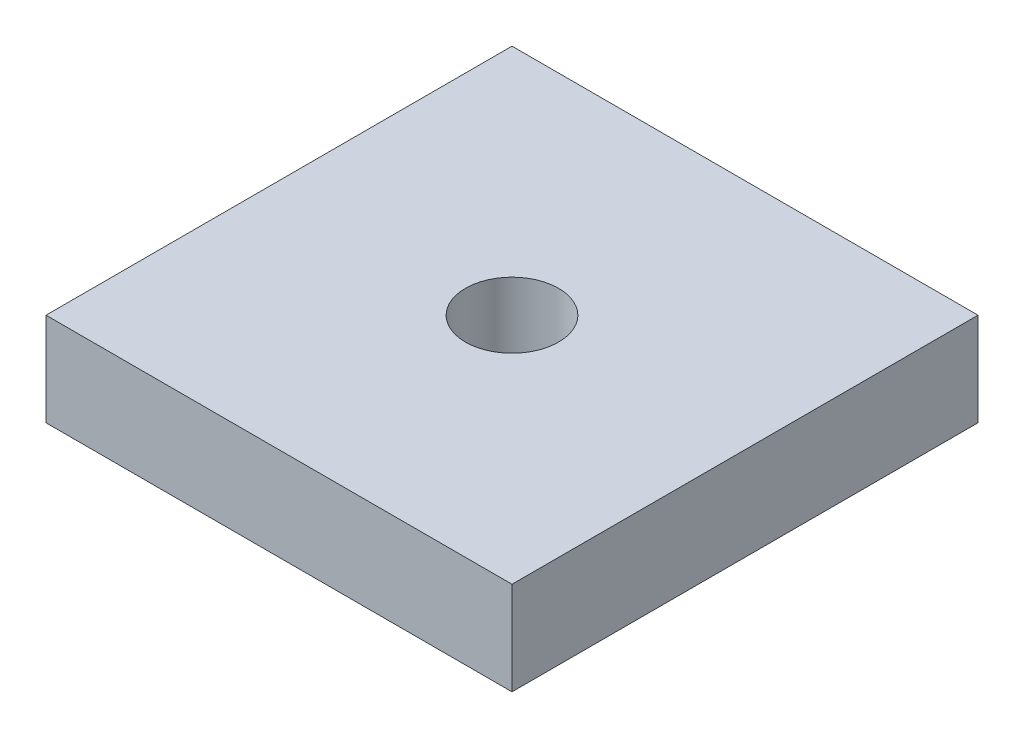
ISO-10303-21;
HEADER;
FILE_DESCRIPTION(('STEP AP214'),'2;1');
FILE_NAME('part.step','',(''),(''),'','','');
FILE_SCHEMA(('AUTOMOTIVE_DESIGN { 1 0 10303 214 1 1 1 1 }'));
ENDSEC;
DATA;
#1=APPLICATION_CONTEXT('core data for automotive mechanical design processes');
#2=APPLICATION_PROTOCOL_DEFINITION('international standard','automotive_design',2000,#1);
#3=PRODUCT_CONTEXT('',#1,'mechanical');
#4=PRODUCT('Part','Part','',(#3));
#5=PRODUCT_RELATED_PRODUCT_CATEGORY('part','',(#4));
#6=PRODUCT_DEFINITION_FORMATION('','',#4);
#7=PRODUCT_DEFINITION_CONTEXT('part definition',#1,'design');
#8=PRODUCT_DEFINITION('design','',#6,#7);
#9=PRODUCT_DEFINITION_SHAPE('','',#8);
#10=(LENGTH_UNIT() NAMED_UNIT(*) SI_UNIT(.MILLI.,.METRE.));
#11=(NAMED_UNIT(*) PLANE_ANGLE_UNIT() SI_UNIT($,.RADIAN.));
#12=(NAMED_UNIT(*) SI_UNIT($,.STERADIAN.) SOLID_ANGLE_UNIT());
#13=UNCERTAINTY_MEASURE_WITH_UNIT(LENGTH_MEASURE(1.E-05),#10,'distance_accuracy_value','');
#14=(GEOMETRIC_REPRESENTATION_CONTEXT(3) GLOBAL_UNCERTAINTY_ASSIGNED_CONTEXT((#13)) GLOBAL_UNIT_ASSIGNED_CONTEXT((#10,
#11,#12)) REPRESENTATION_CONTEXT('',''));
#15=CARTESIAN_POINT('',(0.,0.,0.));
#16=DIRECTION('',(0.,0.,1.));
#17=DIRECTION('',(1.,0.,0.));
#18=AXIS2_PLACEMENT_3D('',#15,#16,#17);
#19=CARTESIAN_POINT('',(-25.,10.,-25.));
#20=DIRECTION('',(1.,0.,0.));
#21=DIRECTION('',(0.,0.,-1.));
#22=AXIS2_PLACEMENT_3D('',#19,#20,#21);
#23=PLANE('',#22);
#24=DIRECTION('',(0.,0.,1.));
#25=VECTOR('',#24,1.);
#26=CARTESIAN_POINT('',(-25.,0.,-25.));
#27=LINE('',#26,#25);
#28=CARTESIAN_POINT('',(-25.,0.,-25.));
#29=VERTEX_POINT('',#28);
#30=CARTESIAN_POINT('',(-25.,0.,25.));
#31=VERTEX_POINT('',#30);
#32=EDGE_CURVE('E98',#29,#31,#27,.T.);
#33=ORIENTED_EDGE('',*,*,#32,.T.);
#34=DIRECTION('',(0.,-1.,0.));
#35=VECTOR('',#34,1.);
#36=CARTESIAN_POINT('',(-25.,10.,25.));
#37=LINE('',#36,#35);
#38=CARTESIAN_POINT('',(-25.,10.,25.));
#39=VERTEX_POINT('',#38);
#40=EDGE_CURVE('E11',#39,#31,#37,.T.);
#41=ORIENTED_EDGE('',*,*,#40,.F.);
#42=DIRECTION('',(0.,0.,1.));
#43=VECTOR('',#42,1.);
#44=CARTESIAN_POINT('',(-25.,10.,-25.));
#45=LINE('',#44,#43);
#46=CARTESIAN_POINT('',(-25.,10.,-25.));
#47=VERTEX_POINT('',#46);
#48=EDGE_CURVE('E86',#47,#39,#45,.T.);
#49=ORIENTED_EDGE('',*,*,#48,.F.);
#50=DIRECTION('',(0.,-1.,0.));
#51=VECTOR('',#50,1.);
#52=CARTESIAN_POINT('',(-25.,10.,-25.));
#53=LINE('',#52,#51);
#54=EDGE_CURVE('E94',#47,#29,#53,.T.);
#55=ORIENTED_EDGE('',*,*,#54,.T.);
#56=EDGE_LOOP('',(#33,#41,#49,#55));
#57=FACE_BOUND('',#56,.T.);
#58=ADVANCED_FACE('F35',(#57),#23,.F.);
#59=CARTESIAN_POINT('',(-25.,10.,25.));
#60=DIRECTION('',(0.,0.,-1.));
#61=DIRECTION('',(-1.,0.,0.));
#62=AXIS2_PLACEMENT_3D('',#59,#60,#61);
#63=PLANE('',#62);
#64=DIRECTION('',(1.,0.,0.));
#65=VECTOR('',#64,1.);
#66=CARTESIAN_POINT('',(-25.,0.,25.));
#67=LINE('',#66,#65);
#68=CARTESIAN_POINT('',(25.,0.,25.));
#69=VERTEX_POINT('',#68);
#70=EDGE_CURVE('E90',#31,#69,#67,.T.);
#71=ORIENTED_EDGE('',*,*,#70,.T.);
#72=DIRECTION('',(0.,-1.,0.));
#73=VECTOR('',#72,1.);
#74=CARTESIAN_POINT('',(25.,10.,25.));
#75=LINE('',#74,#73);
#76=CARTESIAN_POINT('',(25.,10.,25.));
#77=VERTEX_POINT('',#76);
#78=EDGE_CURVE('E43',#77,#69,#75,.T.);
#79=ORIENTED_EDGE('',*,*,#78,.F.);
#80=DIRECTION('',(1.,0.,0.));
#81=VECTOR('',#80,1.);
#82=CARTESIAN_POINT('',(-25.,10.,25.));
#83=LINE('',#82,#81);
#84=EDGE_CURVE('E81',#39,#77,#83,.T.);
#85=ORIENTED_EDGE('',*,*,#84,.F.);
#86=ORIENTED_EDGE('',*,*,#40,.T.);
#87=EDGE_LOOP('',(#71,#79,#85,#86));
#88=FACE_BOUND('',#87,.T.);
#89=ADVANCED_FACE('F89',(#88),#63,.F.);
#90=CARTESIAN_POINT('',(25.,10.,-25.));
#91=DIRECTION('',(-1.,0.,0.));
#92=DIRECTION('',(0.,0.,1.));
#93=AXIS2_PLACEMENT_3D('',#90,#91,#92);
#94=PLANE('',#93);
#95=DIRECTION('',(0.,0.,-1.));
#96=VECTOR('',#95,1.);
#97=CARTESIAN_POINT('',(25.,0.,-25.));
#98=LINE('',#97,#96);
#99=CARTESIAN_POINT('',(25.,0.,-25.));
#100=VERTEX_POINT('',#99);
#101=EDGE_CURVE('E68',#69,#100,#98,.T.);
#102=ORIENTED_EDGE('',*,*,#101,.T.);
#103=DIRECTION('',(0.,-1.,0.));
#104=VECTOR('',#103,1.);
#105=CARTESIAN_POINT('',(25.,10.,-25.));
#106=LINE('',#105,#104);
#107=CARTESIAN_POINT('',(25.,10.,-25.));
#108=VERTEX_POINT('',#107);
#109=EDGE_CURVE('E91',#108,#100,#106,.T.);
#110=ORIENTED_EDGE('',*,*,#109,.F.);
#111=DIRECTION('',(0.,0.,-1.));
#112=VECTOR('',#111,1.);
#113=CARTESIAN_POINT('',(25.,10.,-25.));
#114=LINE('',#113,#112);
#115=EDGE_CURVE('E84',#77,#108,#114,.T.);
#116=ORIENTED_EDGE('',*,*,#115,.F.);
#117=ORIENTED_EDGE('',*,*,#78,.T.);
#118=EDGE_LOOP('',(#102,#110,#116,#117));
#119=FACE_BOUND('',#118,.T.);
#120=ADVANCED_FACE('F92',(#119),#94,.F.);
#121=CARTESIAN_POINT('',(-25.,10.,-25.));
#122=DIRECTION('',(0.,0.,1.));
#123=DIRECTION('',(1.,0.,0.));
#124=AXIS2_PLACEMENT_3D('',#121,#122,#123);
#125=PLANE('',#124);
#126=DIRECTION('',(-1.,0.,0.));
#127=VECTOR('',#126,1.);
#128=CARTESIAN_POINT('',(-25.,0.,-25.));
#129=LINE('',#128,#127);
#130=EDGE_CURVE('E74',#100,#29,#129,.T.);
#131=ORIENTED_EDGE('',*,*,#130,.T.);
#132=ORIENTED_EDGE('',*,*,#54,.F.);
#133=DIRECTION('',(-1.,0.,0.));
#134=VECTOR('',#133,1.);
#135=CARTESIAN_POINT('',(-25.,10.,-25.));
#136=LINE('',#135,#134);
#137=EDGE_CURVE('E51',#108,#47,#136,.T.);
#138=ORIENTED_EDGE('',*,*,#137,.F.);
#139=ORIENTED_EDGE('',*,*,#109,.T.);
#140=EDGE_LOOP('',(#131,#132,#138,#139));
#141=FACE_BOUND('',#140,.T.);
#142=ADVANCED_FACE('F106',(#141),#125,.F.);
#143=CARTESIAN_POINT('',(0.,10.,0.));
#144=DIRECTION('',(0.,1.,0.));
#145=DIRECTION('',(0.,0.,1.));
#146=AXIS2_PLACEMENT_3D('',#143,#144,#145);
#147=PLANE('',#146);
#148=CARTESIAN_POINT('',(0.,10.,0.));
#149=DIRECTION('',(0.,1.,0.));
#150=DIRECTION('',(0.,0.,1.));
#151=AXIS2_PLACEMENT_3D('',#148,#149,#150);
#152=CIRCLE('',#151,5.);
#153=CARTESIAN_POINT('',(0.,10.,5.));
#154=VERTEX_POINT('',#153);
#155=EDGE_CURVE('E112',#154,#154,#152,.T.);
#156=ORIENTED_EDGE('',*,*,#155,.F.);
#157=EDGE_LOOP('',(#156));
#158=FACE_BOUND('',#157,.T.);
#159=ORIENTED_EDGE('',*,*,#48,.T.);
#160=ORIENTED_EDGE('',*,*,#84,.T.);
#161=ORIENTED_EDGE('',*,*,#115,.T.);
#162=ORIENTED_EDGE('',*,*,#137,.T.);
#163=EDGE_LOOP('',(#159,#160,#161,#162));
#164=FACE_BOUND('',#163,.T.);
#165=ADVANCED_FACE('F82',(#158,#164),#147,.T.);
#166=CARTESIAN_POINT('',(0.,0.,0.));
#167=DIRECTION('',(0.,1.,0.));
#168=DIRECTION('',(0.,0.,1.));
#169=AXIS2_PLACEMENT_3D('',#166,#167,#168);
#170=PLANE('',#169);
#171=CARTESIAN_POINT('',(0.,0.,0.));
#172=DIRECTION('',(0.,1.,0.));
#173=DIRECTION('',(0.,0.,1.));
#174=AXIS2_PLACEMENT_3D('',#171,#172,#173);
#175=CIRCLE('',#174,5.);
#176=CARTESIAN_POINT('',(0.,0.,5.));
#177=VERTEX_POINT('',#176);
#178=EDGE_CURVE('E101',#177,#177,#175,.T.);
#179=ORIENTED_EDGE('',*,*,#178,.T.);
#180=EDGE_LOOP('',(#179));
#181=FACE_BOUND('',#180,.T.);
#182=ORIENTED_EDGE('',*,*,#32,.F.);
#183=ORIENTED_EDGE('',*,*,#130,.F.);
#184=ORIENTED_EDGE('',*,*,#101,.F.);
#185=ORIENTED_EDGE('',*,*,#70,.F.);
#186=EDGE_LOOP('',(#182,#183,#184,#185));
#187=FACE_BOUND('',#186,.T.);
#188=ADVANCED_FACE('F109',(#181,#187),#170,.F.);
#189=CARTESIAN_POINT('',(0.,0.,0.));
#190=DIRECTION('',(0.,1.,0.));
#191=DIRECTION('',(0.,0.,1.));
#192=AXIS2_PLACEMENT_3D('',#189,#190,#191);
#193=CYLINDRICAL_SURFACE('',#192,5.);
#194=ORIENTED_EDGE('',*,*,#178,.F.);
#195=EDGE_LOOP('',(#194));
#196=FACE_BOUND('',#195,.T.);
#197=ORIENTED_EDGE('',*,*,#155,.T.);
#198=EDGE_LOOP('',(#197));
#199=FACE_BOUND('',#198,.T.);
#200=ADVANCED_FACE('F119',(#196,#199),#193,.F.);
#201=CLOSED_SHELL('',(#58,#89,#120,#142,#165,#188,#200));
#202=MANIFOLD_SOLID_BREP('B2',#201);
#203=ADVANCED_BREP_SHAPE_REPRESENTATION('',(#18,#202),#14);
#204=SHAPE_DEFINITION_REPRESENTATION(#9,#203);
ENDSEC;
END-ISO-10303-21;
